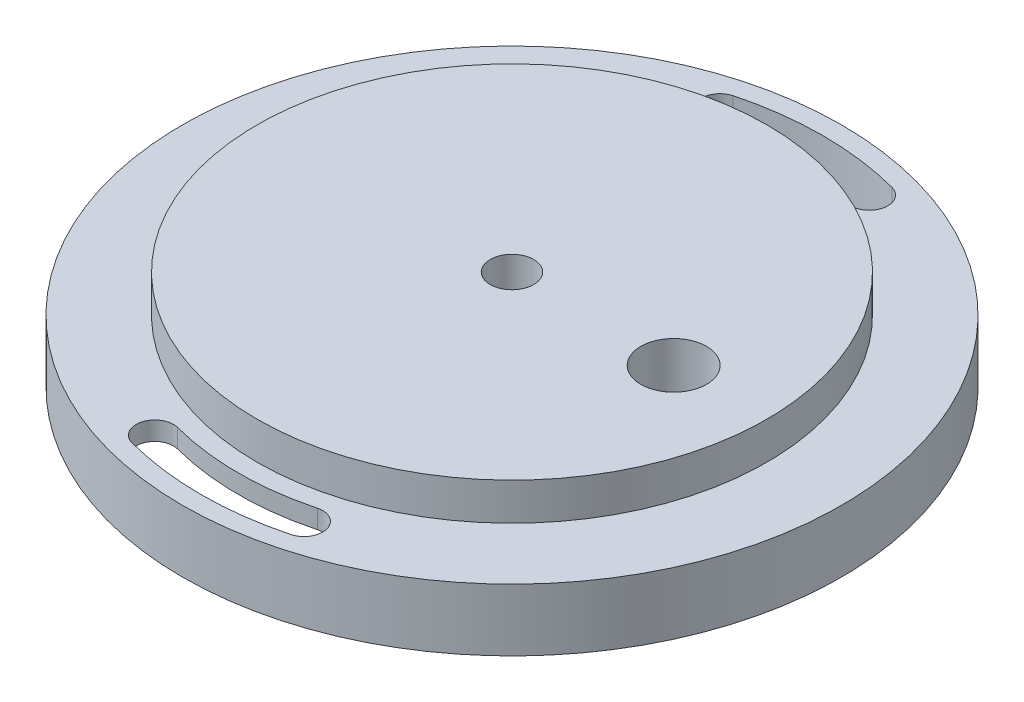
ISO-10303-21;
HEADER;
FILE_DESCRIPTION(('STEP AP214'),'2;1');
FILE_NAME('part.step','',(''),(''),'','','');
FILE_SCHEMA(('AUTOMOTIVE_DESIGN { 1 0 10303 214 1 1 1 1 }'));
ENDSEC;
DATA;
#1=APPLICATION_CONTEXT('core data for automotive mechanical design processes');
#2=APPLICATION_PROTOCOL_DEFINITION('international standard','automotive_design',2000,#1);
#3=PRODUCT_CONTEXT('',#1,'mechanical');
#4=PRODUCT('Part','Part','',(#3));
#5=PRODUCT_RELATED_PRODUCT_CATEGORY('part','',(#4));
#6=PRODUCT_DEFINITION_FORMATION('','',#4);
#7=PRODUCT_DEFINITION_CONTEXT('part definition',#1,'design');
#8=PRODUCT_DEFINITION('design','',#6,#7);
#9=PRODUCT_DEFINITION_SHAPE('','',#8);
#10=(LENGTH_UNIT() NAMED_UNIT(*) SI_UNIT(.MILLI.,.METRE.));
#11=(NAMED_UNIT(*) PLANE_ANGLE_UNIT() SI_UNIT($,.RADIAN.));
#12=(NAMED_UNIT(*) SI_UNIT($,.STERADIAN.) SOLID_ANGLE_UNIT());
#13=UNCERTAINTY_MEASURE_WITH_UNIT(LENGTH_MEASURE(1.E-05),#10,'distance_accuracy_value','');
#14=(GEOMETRIC_REPRESENTATION_CONTEXT(3) GLOBAL_UNCERTAINTY_ASSIGNED_CONTEXT((#13)) GLOBAL_UNIT_ASSIGNED_CONTEXT((#10,
#11,#12)) REPRESENTATION_CONTEXT('',''));
#15=CARTESIAN_POINT('',(0.,0.,0.));
#16=DIRECTION('',(0.,0.,1.));
#17=DIRECTION('',(1.,0.,0.));
#18=AXIS2_PLACEMENT_3D('',#15,#16,#17);
#19=CARTESIAN_POINT('',(-25.,30.6,0.));
#20=DIRECTION('',(0.,1.,0.));
#21=DIRECTION('',(0.,0.,1.));
#22=AXIS2_PLACEMENT_3D('',#19,#20,#21);
#23=PLANE('',#22);
#24=CARTESIAN_POINT('',(0.,30.6,0.));
#25=DIRECTION('',(0.,-1.,0.));
#26=DIRECTION('',(0.,0.,-1.));
#27=AXIS2_PLACEMENT_3D('',#24,#25,#26);
#28=CIRCLE('',#27,25.);
#29=CARTESIAN_POINT('',(0.,30.6,-25.));
#30=VERTEX_POINT('',#29);
#31=EDGE_CURVE('E164',#30,#30,#28,.T.);
#32=ORIENTED_EDGE('',*,*,#31,.F.);
#33=EDGE_LOOP('',(#32));
#34=FACE_BOUND('',#33,.T.);
#35=CARTESIAN_POINT('',(0.,30.6,0.));
#36=DIRECTION('',(0.,-1.,0.));
#37=DIRECTION('',(0.,0.,-1.));
#38=AXIS2_PLACEMENT_3D('',#35,#36,#37);
#39=CIRCLE('',#38,26.5);
#40=CARTESIAN_POINT('',(0.,30.6,-26.5));
#41=VERTEX_POINT('',#40);
#42=EDGE_CURVE('E186',#41,#41,#39,.T.);
#43=ORIENTED_EDGE('',*,*,#42,.T.);
#44=EDGE_LOOP('',(#43));
#45=FACE_BOUND('',#44,.T.);
#46=ADVANCED_FACE('F36',(#34,#45),#23,.F.);
#47=CARTESIAN_POINT('',(0.,29.900525332038,0.));
#48=DIRECTION('',(0.,-1.,0.));
#49=DIRECTION('',(0.,0.,-1.));
#50=AXIS2_PLACEMENT_3D('',#47,#48,#49);
#51=CYLINDRICAL_SURFACE('',#50,26.5);
#52=ORIENTED_EDGE('',*,*,#42,.F.);
#53=EDGE_LOOP('',(#52));
#54=FACE_BOUND('',#53,.T.);
#55=CARTESIAN_POINT('',(0.,35.6,0.));
#56=DIRECTION('',(0.,-1.,0.));
#57=DIRECTION('',(0.,0.,-1.));
#58=AXIS2_PLACEMENT_3D('',#55,#56,#57);
#59=CIRCLE('',#58,26.5);
#60=CARTESIAN_POINT('',(0.,35.6,-26.5));
#61=VERTEX_POINT('',#60);
#62=EDGE_CURVE('E183',#61,#61,#59,.T.);
#63=ORIENTED_EDGE('',*,*,#62,.T.);
#64=EDGE_LOOP('',(#63));
#65=FACE_BOUND('',#64,.T.);
#66=ADVANCED_FACE('F220',(#54,#65),#51,.T.);
#67=CARTESIAN_POINT('',(-26.5,35.6,0.));
#68=DIRECTION('',(0.,-1.,0.));
#69=DIRECTION('',(0.,0.,-1.));
#70=AXIS2_PLACEMENT_3D('',#67,#68,#69);
#71=PLANE('',#70);
#72=CARTESIAN_POINT('',(-6.,35.6,-22.7211355350035));
#73=DIRECTION('',(0.,1.,0.));
#74=DIRECTION('',(0.,0.,-1.));
#75=AXIS2_PLACEMENT_3D('',#72,#73,#74);
#76=CIRCLE('',#75,1.5);
#77=CARTESIAN_POINT('',(-6.38297872340426,35.6,-24.1714207819186));
#78=VERTEX_POINT('',#77);
#79=CARTESIAN_POINT('',(-5.61702127659574,35.6,-21.2708502880884));
#80=VERTEX_POINT('',#79);
#81=EDGE_CURVE('E115',#78,#80,#76,.T.);
#82=ORIENTED_EDGE('',*,*,#81,.F.);
#83=CARTESIAN_POINT('',(0.,35.6,0.));
#84=DIRECTION('',(0.,1.,0.));
#85=DIRECTION('',(0.,0.,-1.));
#86=AXIS2_PLACEMENT_3D('',#83,#84,#85);
#87=CIRCLE('',#86,25.);
#88=CARTESIAN_POINT('',(6.38297872340426,35.6,-24.1714207819186));
#89=VERTEX_POINT('',#88);
#90=EDGE_CURVE('E50',#89,#78,#87,.T.);
#91=ORIENTED_EDGE('',*,*,#90,.F.);
#92=CARTESIAN_POINT('',(6.,35.6,-22.7211355350035));
#93=DIRECTION('',(0.,1.,0.));
#94=DIRECTION('',(0.,0.,-1.));
#95=AXIS2_PLACEMENT_3D('',#92,#93,#94);
#96=CIRCLE('',#95,1.5);
#97=CARTESIAN_POINT('',(5.61702127659574,35.6,-21.2708502880884));
#98=VERTEX_POINT('',#97);
#99=EDGE_CURVE('E122',#98,#89,#96,.T.);
#100=ORIENTED_EDGE('',*,*,#99,.F.);
#101=CARTESIAN_POINT('',(0.,35.6,0.));
#102=DIRECTION('',(0.,-1.,0.));
#103=DIRECTION('',(0.,0.,-1.));
#104=AXIS2_PLACEMENT_3D('',#101,#102,#103);
#105=CIRCLE('',#104,22.);
#106=EDGE_CURVE('E107',#80,#98,#105,.T.);
#107=ORIENTED_EDGE('',*,*,#106,.F.);
#108=EDGE_LOOP('',(#82,#91,#100,#107));
#109=FACE_BOUND('',#108,.T.);
#110=CARTESIAN_POINT('',(-6.,35.6,22.7211355350035));
#111=DIRECTION('',(0.,1.,0.));
#112=DIRECTION('',(0.,0.,1.));
#113=AXIS2_PLACEMENT_3D('',#110,#111,#112);
#114=CIRCLE('',#113,1.5);
#115=CARTESIAN_POINT('',(-5.61702127659574,35.6,21.2708502880884));
#116=VERTEX_POINT('',#115);
#117=CARTESIAN_POINT('',(-6.38297872340425,35.6,24.1714207819186));
#118=VERTEX_POINT('',#117);
#119=EDGE_CURVE('E133',#116,#118,#114,.T.);
#120=ORIENTED_EDGE('',*,*,#119,.F.);
#121=CARTESIAN_POINT('',(0.,35.6,0.));
#122=DIRECTION('',(0.,-1.,0.));
#123=DIRECTION('',(0.,0.,1.));
#124=AXIS2_PLACEMENT_3D('',#121,#122,#123);
#125=CIRCLE('',#124,22.);
#126=CARTESIAN_POINT('',(5.61702127659574,35.6,21.2708502880884));
#127=VERTEX_POINT('',#126);
#128=EDGE_CURVE('E58',#127,#116,#125,.T.);
#129=ORIENTED_EDGE('',*,*,#128,.F.);
#130=CARTESIAN_POINT('',(6.,35.6,22.7211355350035));
#131=DIRECTION('',(0.,1.,0.));
#132=DIRECTION('',(0.,0.,1.));
#133=AXIS2_PLACEMENT_3D('',#130,#131,#132);
#134=CIRCLE('',#133,1.5);
#135=CARTESIAN_POINT('',(6.38297872340426,35.6,24.1714207819186));
#136=VERTEX_POINT('',#135);
#137=EDGE_CURVE('E139',#136,#127,#134,.T.);
#138=ORIENTED_EDGE('',*,*,#137,.F.);
#139=CARTESIAN_POINT('',(0.,35.6,0.));
#140=DIRECTION('',(0.,1.,0.));
#141=DIRECTION('',(0.,0.,1.));
#142=AXIS2_PLACEMENT_3D('',#139,#140,#141);
#143=CIRCLE('',#142,25.);
#144=EDGE_CURVE('E136',#118,#136,#143,.T.);
#145=ORIENTED_EDGE('',*,*,#144,.F.);
#146=EDGE_LOOP('',(#120,#129,#138,#145));
#147=FACE_BOUND('',#146,.T.);
#148=ORIENTED_EDGE('',*,*,#62,.F.);
#149=EDGE_LOOP('',(#148));
#150=FACE_BOUND('',#149,.T.);
#151=CARTESIAN_POINT('',(0.,35.6,0.));
#152=DIRECTION('',(0.,-1.,0.));
#153=DIRECTION('',(0.,0.,-1.));
#154=AXIS2_PLACEMENT_3D('',#151,#152,#153);
#155=CIRCLE('',#154,20.5);
#156=CARTESIAN_POINT('',(0.,35.6,-20.5));
#157=VERTEX_POINT('',#156);
#158=EDGE_CURVE('E180',#157,#157,#155,.T.);
#159=ORIENTED_EDGE('',*,*,#158,.T.);
#160=EDGE_LOOP('',(#159));
#161=FACE_BOUND('',#160,.T.);
#162=ADVANCED_FACE('F119',(#109,#147,#150,#161),#71,.F.);
#163=CARTESIAN_POINT('',(0.,29.900525332038,0.));
#164=DIRECTION('',(0.,-1.,0.));
#165=DIRECTION('',(0.,0.,-1.));
#166=AXIS2_PLACEMENT_3D('',#163,#164,#165);
#167=CYLINDRICAL_SURFACE('',#166,20.5);
#168=ORIENTED_EDGE('',*,*,#158,.F.);
#169=EDGE_LOOP('',(#168));
#170=FACE_BOUND('',#169,.T.);
#171=CARTESIAN_POINT('',(0.,38.6,0.));
#172=DIRECTION('',(0.,-1.,0.));
#173=DIRECTION('',(0.,0.,-1.));
#174=AXIS2_PLACEMENT_3D('',#171,#172,#173);
#175=CIRCLE('',#174,20.5);
#176=CARTESIAN_POINT('',(0.,38.6,-20.5));
#177=VERTEX_POINT('',#176);
#178=EDGE_CURVE('E177',#177,#177,#175,.T.);
#179=ORIENTED_EDGE('',*,*,#178,.T.);
#180=EDGE_LOOP('',(#179));
#181=FACE_BOUND('',#180,.T.);
#182=ADVANCED_FACE('F233',(#170,#181),#167,.T.);
#183=CARTESIAN_POINT('',(-20.5,38.6,0.));
#184=DIRECTION('',(0.,-1.,0.));
#185=DIRECTION('',(0.,0.,-1.));
#186=AXIS2_PLACEMENT_3D('',#183,#184,#185);
#187=PLANE('',#186);
#188=CARTESIAN_POINT('',(13.,38.6,0.));
#189=DIRECTION('',(0.,-1.,0.));
#190=DIRECTION('',(1.,0.,0.));
#191=AXIS2_PLACEMENT_3D('',#188,#189,#190);
#192=CIRCLE('',#191,2.64559279724283);
#193=CARTESIAN_POINT('',(15.6455927972428,38.6,0.));
#194=VERTEX_POINT('',#193);
#195=EDGE_CURVE('E160',#194,#194,#192,.T.);
#196=ORIENTED_EDGE('',*,*,#195,.T.);
#197=EDGE_LOOP('',(#196));
#198=FACE_BOUND('',#197,.T.);
#199=ORIENTED_EDGE('',*,*,#178,.F.);
#200=EDGE_LOOP('',(#199));
#201=FACE_BOUND('',#200,.T.);
#202=CARTESIAN_POINT('',(0.,38.6,0.));
#203=DIRECTION('',(0.,-1.,0.));
#204=DIRECTION('',(0.,0.,-1.));
#205=AXIS2_PLACEMENT_3D('',#202,#203,#204);
#206=CIRCLE('',#205,1.75);
#207=CARTESIAN_POINT('',(0.,38.6,-1.75));
#208=VERTEX_POINT('',#207);
#209=EDGE_CURVE('E174',#208,#208,#206,.T.);
#210=ORIENTED_EDGE('',*,*,#209,.T.);
#211=EDGE_LOOP('',(#210));
#212=FACE_BOUND('',#211,.T.);
#213=ADVANCED_FACE('F239',(#198,#201,#212),#187,.F.);
#214=CARTESIAN_POINT('',(0.,29.900525332038,0.));
#215=DIRECTION('',(0.,-1.,0.));
#216=DIRECTION('',(0.,0.,-1.));
#217=AXIS2_PLACEMENT_3D('',#214,#215,#216);
#218=CYLINDRICAL_SURFACE('',#217,1.75);
#219=ORIENTED_EDGE('',*,*,#209,.F.);
#220=EDGE_LOOP('',(#219));
#221=FACE_BOUND('',#220,.T.);
#222=CARTESIAN_POINT('',(0.,34.1,0.));
#223=DIRECTION('',(0.,-1.,0.));
#224=DIRECTION('',(0.,0.,-1.));
#225=AXIS2_PLACEMENT_3D('',#222,#223,#224);
#226=CIRCLE('',#225,1.75);
#227=CARTESIAN_POINT('',(0.,34.1,-1.75));
#228=VERTEX_POINT('',#227);
#229=EDGE_CURVE('E171',#228,#228,#226,.T.);
#230=ORIENTED_EDGE('',*,*,#229,.T.);
#231=EDGE_LOOP('',(#230));
#232=FACE_BOUND('',#231,.T.);
#233=ADVANCED_FACE('F245',(#221,#232),#218,.F.);
#234=CARTESIAN_POINT('',(-24.5238842715332,34.1,0.));
#235=DIRECTION('',(0.,1.,0.));
#236=DIRECTION('',(0.,0.,1.));
#237=AXIS2_PLACEMENT_3D('',#234,#235,#236);
#238=PLANE('',#237);
#239=CARTESIAN_POINT('',(13.,34.1,0.));
#240=DIRECTION('',(0.,1.,0.));
#241=DIRECTION('',(0.,0.,1.));
#242=AXIS2_PLACEMENT_3D('',#239,#240,#241);
#243=CIRCLE('',#242,2.64559279724284);
#244=CARTESIAN_POINT('',(13.,34.1,2.64559279724284));
#245=VERTEX_POINT('',#244);
#246=EDGE_CURVE('E163',#245,#245,#243,.F.);
#247=ORIENTED_EDGE('',*,*,#246,.F.);
#248=EDGE_LOOP('',(#247));
#249=FACE_BOUND('',#248,.T.);
#250=ORIENTED_EDGE('',*,*,#229,.F.);
#251=EDGE_LOOP('',(#250));
#252=FACE_BOUND('',#251,.T.);
#253=CARTESIAN_POINT('',(0.,34.1,0.));
#254=DIRECTION('',(0.,1.,0.));
#255=DIRECTION('',(0.,0.,1.));
#256=AXIS2_PLACEMENT_3D('',#253,#254,#255);
#257=CIRCLE('',#256,22.);
#258=CARTESIAN_POINT('',(-5.61702127659574,34.1,-21.2708502880884));
#259=VERTEX_POINT('',#258);
#260=CARTESIAN_POINT('',(5.61702127659574,34.1,-21.2708502880884));
#261=VERTEX_POINT('',#260);
#262=EDGE_CURVE('E11',#259,#261,#257,.F.);
#263=ORIENTED_EDGE('',*,*,#262,.T.);
#264=CARTESIAN_POINT('',(6.,34.1,-22.7211355350035));
#265=DIRECTION('',(0.,1.,0.));
#266=DIRECTION('',(0.,0.,1.));
#267=AXIS2_PLACEMENT_3D('',#264,#265,#266);
#268=CIRCLE('',#267,1.5);
#269=CARTESIAN_POINT('',(6.38297872340426,34.1,-24.1714207819186));
#270=VERTEX_POINT('',#269);
#271=EDGE_CURVE('E157',#261,#270,#268,.T.);
#272=ORIENTED_EDGE('',*,*,#271,.T.);
#273=CARTESIAN_POINT('',(0.,34.1,0.));
#274=DIRECTION('',(0.,-1.,0.));
#275=DIRECTION('',(0.,0.,-1.));
#276=AXIS2_PLACEMENT_3D('',#273,#274,#275);
#277=CIRCLE('',#276,25.);
#278=CARTESIAN_POINT('',(6.38297872340426,34.1,24.1714207819186));
#279=VERTEX_POINT('',#278);
#280=EDGE_CURVE('E168',#270,#279,#277,.T.);
#281=ORIENTED_EDGE('',*,*,#280,.T.);
#282=CARTESIAN_POINT('',(6.,34.1,22.7211355350035));
#283=DIRECTION('',(0.,1.,0.));
#284=DIRECTION('',(0.,0.,1.));
#285=AXIS2_PLACEMENT_3D('',#282,#283,#284);
#286=CIRCLE('',#285,1.5);
#287=CARTESIAN_POINT('',(5.61702127659574,34.1,21.2708502880884));
#288=VERTEX_POINT('',#287);
#289=EDGE_CURVE('E152',#279,#288,#286,.T.);
#290=ORIENTED_EDGE('',*,*,#289,.T.);
#291=CARTESIAN_POINT('',(0.,34.1,0.));
#292=DIRECTION('',(0.,1.,0.));
#293=DIRECTION('',(0.,0.,1.));
#294=AXIS2_PLACEMENT_3D('',#291,#292,#293);
#295=CIRCLE('',#294,22.);
#296=CARTESIAN_POINT('',(-5.61702127659574,34.1,21.2708502880884));
#297=VERTEX_POINT('',#296);
#298=EDGE_CURVE('E43',#288,#297,#295,.F.);
#299=ORIENTED_EDGE('',*,*,#298,.T.);
#300=CARTESIAN_POINT('',(-6.,34.1,22.7211355350035));
#301=DIRECTION('',(0.,1.,0.));
#302=DIRECTION('',(0.,0.,1.));
#303=AXIS2_PLACEMENT_3D('',#300,#301,#302);
#304=CIRCLE('',#303,1.5);
#305=CARTESIAN_POINT('',(-6.38297872340426,34.1,24.1714207819187));
#306=VERTEX_POINT('',#305);
#307=EDGE_CURVE('E129',#297,#306,#304,.T.);
#308=ORIENTED_EDGE('',*,*,#307,.T.);
#309=CARTESIAN_POINT('',(-6.38297872340426,34.1,-24.1714207819186));
#310=VERTEX_POINT('',#309);
#311=EDGE_CURVE('E167',#306,#310,#277,.T.);
#312=ORIENTED_EDGE('',*,*,#311,.T.);
#313=CARTESIAN_POINT('',(-6.,34.1,-22.7211355350035));
#314=DIRECTION('',(0.,1.,0.));
#315=DIRECTION('',(0.,0.,1.));
#316=AXIS2_PLACEMENT_3D('',#313,#314,#315);
#317=CIRCLE('',#316,1.5);
#318=EDGE_CURVE('E155',#310,#259,#317,.T.);
#319=ORIENTED_EDGE('',*,*,#318,.T.);
#320=EDGE_LOOP('',(#263,#272,#281,#290,#299,#308,#312,#319));
#321=FACE_BOUND('',#320,.T.);
#322=ADVANCED_FACE('F192',(#249,#252,#321),#238,.F.);
#323=CARTESIAN_POINT('',(0.,29.900525332038,0.));
#324=DIRECTION('',(0.,-1.,0.));
#325=DIRECTION('',(0.,0.,-1.));
#326=AXIS2_PLACEMENT_3D('',#323,#324,#325);
#327=CYLINDRICAL_SURFACE('',#326,25.);
#328=ORIENTED_EDGE('',*,*,#280,.F.);
#329=DIRECTION('',(0.,1.,0.));
#330=VECTOR('',#329,1.);
#331=CARTESIAN_POINT('',(6.38297872340426,15.6,-24.1714207819186));
#332=LINE('',#331,#330);
#333=EDGE_CURVE('E127',#270,#89,#332,.T.);
#334=ORIENTED_EDGE('',*,*,#333,.T.);
#335=ORIENTED_EDGE('',*,*,#90,.T.);
#336=DIRECTION('',(0.,1.,0.));
#337=VECTOR('',#336,1.);
#338=CARTESIAN_POINT('',(-6.38297872340426,15.6,-24.1714207819186));
#339=LINE('',#338,#337);
#340=EDGE_CURVE('E112',#310,#78,#339,.T.);
#341=ORIENTED_EDGE('',*,*,#340,.F.);
#342=ORIENTED_EDGE('',*,*,#311,.F.);
#343=DIRECTION('',(0.,1.,0.));
#344=VECTOR('',#343,1.);
#345=CARTESIAN_POINT('',(-6.38297872340425,15.6,24.1714207819186));
#346=LINE('',#345,#344);
#347=EDGE_CURVE('E147',#306,#118,#346,.T.);
#348=ORIENTED_EDGE('',*,*,#347,.T.);
#349=ORIENTED_EDGE('',*,*,#144,.T.);
#350=DIRECTION('',(0.,1.,0.));
#351=VECTOR('',#350,1.);
#352=CARTESIAN_POINT('',(6.38297872340426,15.6,24.1714207819186));
#353=LINE('',#352,#351);
#354=EDGE_CURVE('E145',#279,#136,#353,.T.);
#355=ORIENTED_EDGE('',*,*,#354,.F.);
#356=EDGE_LOOP('',(#328,#334,#335,#341,#342,#348,#349,#355));
#357=FACE_BOUND('',#356,.T.);
#358=ORIENTED_EDGE('',*,*,#31,.T.);
#359=EDGE_LOOP('',(#358));
#360=FACE_BOUND('',#359,.T.);
#361=ADVANCED_FACE('F207',(#357,#360),#327,.F.);
#362=CARTESIAN_POINT('',(13.,30.6,0.));
#363=DIRECTION('',(0.,-1.,0.));
#364=DIRECTION('',(1.,0.,0.));
#365=AXIS2_PLACEMENT_3D('',#362,#363,#364);
#366=CYLINDRICAL_SURFACE('',#365,2.64559279724284);
#367=ORIENTED_EDGE('',*,*,#195,.F.);
#368=EDGE_LOOP('',(#367));
#369=FACE_BOUND('',#368,.T.);
#370=ORIENTED_EDGE('',*,*,#246,.T.);
#371=EDGE_LOOP('',(#370));
#372=FACE_BOUND('',#371,.T.);
#373=ADVANCED_FACE('F261',(#369,#372),#366,.F.);
#374=CARTESIAN_POINT('',(0.,15.6,0.));
#375=DIRECTION('',(0.,1.,0.));
#376=DIRECTION('',(0.,0.,1.));
#377=AXIS2_PLACEMENT_3D('',#374,#375,#376);
#378=CYLINDRICAL_SURFACE('',#377,22.);
#379=DIRECTION('',(0.,1.,0.));
#380=VECTOR('',#379,1.);
#381=CARTESIAN_POINT('',(5.61702127659574,15.6,21.2708502880884));
#382=LINE('',#381,#380);
#383=EDGE_CURVE('E143',#288,#127,#382,.T.);
#384=ORIENTED_EDGE('',*,*,#383,.T.);
#385=ORIENTED_EDGE('',*,*,#128,.T.);
#386=DIRECTION('',(0.,1.,0.));
#387=VECTOR('',#386,1.);
#388=CARTESIAN_POINT('',(-5.61702127659574,15.6,21.2708502880884));
#389=LINE('',#388,#387);
#390=EDGE_CURVE('E142',#297,#116,#389,.T.);
#391=ORIENTED_EDGE('',*,*,#390,.F.);
#392=ORIENTED_EDGE('',*,*,#298,.F.);
#393=EDGE_LOOP('',(#384,#385,#391,#392));
#394=FACE_BOUND('',#393,.T.);
#395=ADVANCED_FACE('F196',(#394),#378,.T.);
#396=CARTESIAN_POINT('',(6.,15.6,22.7211355350035));
#397=DIRECTION('',(0.,1.,0.));
#398=DIRECTION('',(0.,0.,1.));
#399=AXIS2_PLACEMENT_3D('',#396,#397,#398);
#400=CYLINDRICAL_SURFACE('',#399,1.5);
#401=ORIENTED_EDGE('',*,*,#354,.T.);
#402=ORIENTED_EDGE('',*,*,#137,.T.);
#403=ORIENTED_EDGE('',*,*,#383,.F.);
#404=ORIENTED_EDGE('',*,*,#289,.F.);
#405=EDGE_LOOP('',(#401,#402,#403,#404));
#406=FACE_BOUND('',#405,.T.);
#407=ADVANCED_FACE('F198',(#406),#400,.F.);
#408=CARTESIAN_POINT('',(-6.,15.6,22.7211355350035));
#409=DIRECTION('',(0.,1.,0.));
#410=DIRECTION('',(0.,0.,1.));
#411=AXIS2_PLACEMENT_3D('',#408,#409,#410);
#412=CYLINDRICAL_SURFACE('',#411,1.5);
#413=ORIENTED_EDGE('',*,*,#390,.T.);
#414=ORIENTED_EDGE('',*,*,#119,.T.);
#415=ORIENTED_EDGE('',*,*,#347,.F.);
#416=ORIENTED_EDGE('',*,*,#307,.F.);
#417=EDGE_LOOP('',(#413,#414,#415,#416));
#418=FACE_BOUND('',#417,.T.);
#419=ADVANCED_FACE('F205',(#418),#412,.F.);
#420=CARTESIAN_POINT('',(0.,15.6,0.));
#421=DIRECTION('',(0.,1.,0.));
#422=DIRECTION('',(0.,0.,1.));
#423=AXIS2_PLACEMENT_3D('',#420,#421,#422);
#424=CYLINDRICAL_SURFACE('',#423,22.);
#425=DIRECTION('',(0.,1.,0.));
#426=VECTOR('',#425,1.);
#427=CARTESIAN_POINT('',(-5.61702127659574,15.6,-21.2708502880884));
#428=LINE('',#427,#426);
#429=EDGE_CURVE('E102',#259,#80,#428,.T.);
#430=ORIENTED_EDGE('',*,*,#429,.T.);
#431=ORIENTED_EDGE('',*,*,#106,.T.);
#432=DIRECTION('',(0.,1.,0.));
#433=VECTOR('',#432,1.);
#434=CARTESIAN_POINT('',(5.61702127659574,15.6,-21.2708502880884));
#435=LINE('',#434,#433);
#436=EDGE_CURVE('E111',#261,#98,#435,.T.);
#437=ORIENTED_EDGE('',*,*,#436,.F.);
#438=ORIENTED_EDGE('',*,*,#262,.F.);
#439=EDGE_LOOP('',(#430,#431,#437,#438));
#440=FACE_BOUND('',#439,.T.);
#441=ADVANCED_FACE('F104',(#440),#424,.T.);
#442=CARTESIAN_POINT('',(6.,15.6,-22.7211355350035));
#443=DIRECTION('',(0.,1.,0.));
#444=DIRECTION('',(0.,0.,1.));
#445=AXIS2_PLACEMENT_3D('',#442,#443,#444);
#446=CYLINDRICAL_SURFACE('',#445,1.5);
#447=ORIENTED_EDGE('',*,*,#436,.T.);
#448=ORIENTED_EDGE('',*,*,#99,.T.);
#449=ORIENTED_EDGE('',*,*,#333,.F.);
#450=ORIENTED_EDGE('',*,*,#271,.F.);
#451=EDGE_LOOP('',(#447,#448,#449,#450));
#452=FACE_BOUND('',#451,.T.);
#453=ADVANCED_FACE('F210',(#452),#446,.F.);
#454=CARTESIAN_POINT('',(-6.,15.6,-22.7211355350035));
#455=DIRECTION('',(0.,1.,0.));
#456=DIRECTION('',(0.,0.,1.));
#457=AXIS2_PLACEMENT_3D('',#454,#455,#456);
#458=CYLINDRICAL_SURFACE('',#457,1.5);
#459=ORIENTED_EDGE('',*,*,#340,.T.);
#460=ORIENTED_EDGE('',*,*,#81,.T.);
#461=ORIENTED_EDGE('',*,*,#429,.F.);
#462=ORIENTED_EDGE('',*,*,#318,.F.);
#463=EDGE_LOOP('',(#459,#460,#461,#462));
#464=FACE_BOUND('',#463,.T.);
#465=ADVANCED_FACE('F116',(#464),#458,.F.);
#466=CLOSED_SHELL('',(#46,#66,#162,#182,#213,#233,#322,#361,#373,#395,#407,#419,#441,#453,#465));
#467=MANIFOLD_SOLID_BREP('B2',#466);
#468=ADVANCED_BREP_SHAPE_REPRESENTATION('',(#18,#467),#14);
#469=SHAPE_DEFINITION_REPRESENTATION(#9,#468);
ENDSEC;
END-ISO-10303-21;
